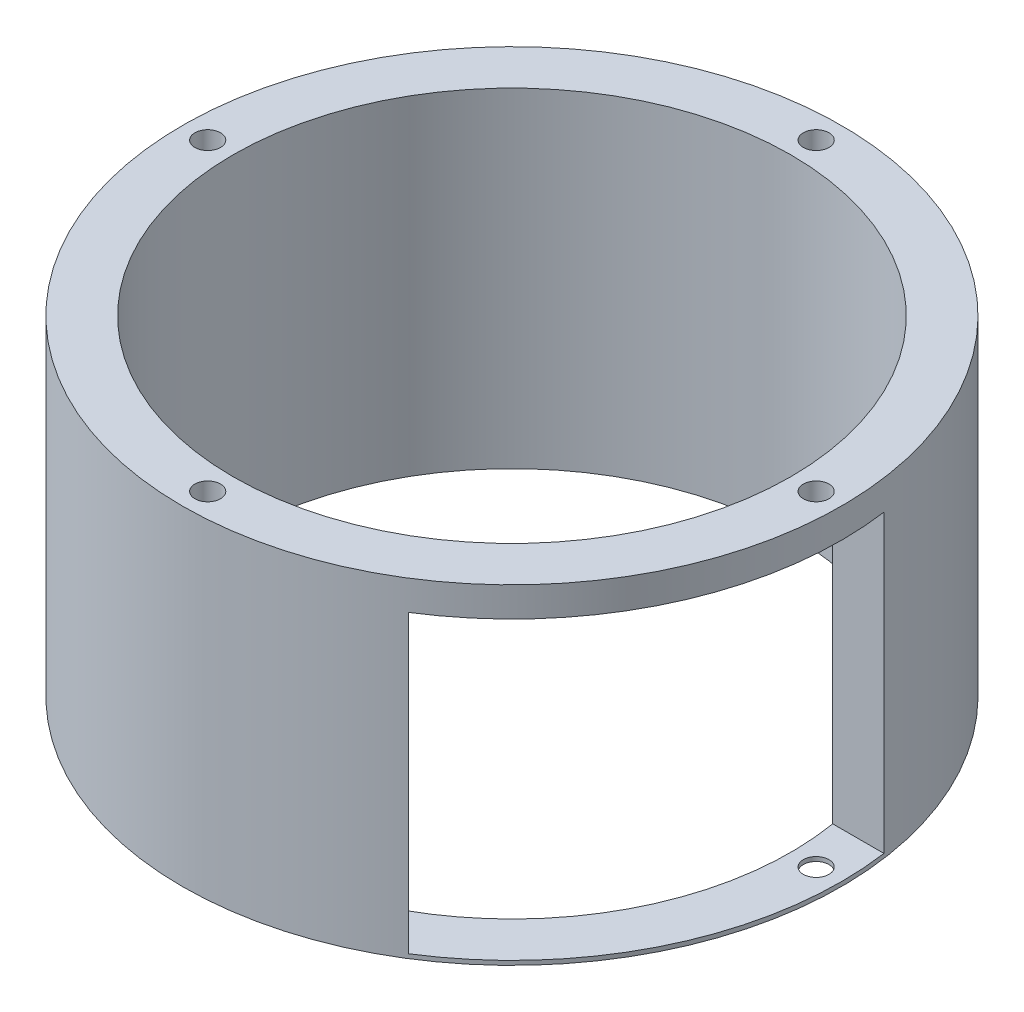
ISO-10303-21;
HEADER;
FILE_DESCRIPTION(('STEP AP214'),'2;1');
FILE_NAME('part.step','',(''),(''),'','','');
FILE_SCHEMA(('AUTOMOTIVE_DESIGN { 1 0 10303 214 1 1 1 1 }'));
ENDSEC;
DATA;
#1=APPLICATION_CONTEXT('core data for automotive mechanical design processes');
#2=APPLICATION_PROTOCOL_DEFINITION('international standard','automotive_design',2000,#1);
#3=PRODUCT_CONTEXT('',#1,'mechanical');
#4=PRODUCT('Part','Part','',(#3));
#5=PRODUCT_RELATED_PRODUCT_CATEGORY('part','',(#4));
#6=PRODUCT_DEFINITION_FORMATION('','',#4);
#7=PRODUCT_DEFINITION_CONTEXT('part definition',#1,'design');
#8=PRODUCT_DEFINITION('design','',#6,#7);
#9=PRODUCT_DEFINITION_SHAPE('','',#8);
#10=(LENGTH_UNIT() NAMED_UNIT(*) SI_UNIT(.MILLI.,.METRE.));
#11=(NAMED_UNIT(*) PLANE_ANGLE_UNIT() SI_UNIT($,.RADIAN.));
#12=(NAMED_UNIT(*) SI_UNIT($,.STERADIAN.) SOLID_ANGLE_UNIT());
#13=UNCERTAINTY_MEASURE_WITH_UNIT(LENGTH_MEASURE(1.E-05),#10,'distance_accuracy_value','');
#14=(GEOMETRIC_REPRESENTATION_CONTEXT(3) GLOBAL_UNCERTAINTY_ASSIGNED_CONTEXT((#13)) GLOBAL_UNIT_ASSIGNED_CONTEXT((#10,
#11,#12)) REPRESENTATION_CONTEXT('',''));
#15=CARTESIAN_POINT('',(0.,0.,0.));
#16=DIRECTION('',(0.,0.,1.));
#17=DIRECTION('',(1.,0.,0.));
#18=AXIS2_PLACEMENT_3D('',#15,#16,#17);
#19=CARTESIAN_POINT('',(0.,65.,0.));
#20=DIRECTION('',(0.,-1.,0.));
#21=DIRECTION('',(0.,0.,-1.));
#22=AXIS2_PLACEMENT_3D('',#19,#20,#21);
#23=CYLINDRICAL_SURFACE('',#22,55.);
#24=CARTESIAN_POINT('',(0.,65.,0.));
#25=DIRECTION('',(0.,1.,0.));
#26=DIRECTION('',(0.,0.,1.));
#27=AXIS2_PLACEMENT_3D('',#24,#25,#26);
#28=CIRCLE('',#27,55.);
#29=CARTESIAN_POINT('',(0.,65.,55.));
#30=VERTEX_POINT('',#29);
#31=EDGE_CURVE('E190',#30,#30,#28,.T.);
#32=ORIENTED_EDGE('',*,*,#31,.T.);
#33=EDGE_LOOP('',(#32));
#34=FACE_BOUND('',#33,.T.);
#35=CARTESIAN_POINT('',(0.,0.,0.));
#36=DIRECTION('',(0.,1.,0.));
#37=DIRECTION('',(0.,0.,1.));
#38=AXIS2_PLACEMENT_3D('',#35,#36,#37);
#39=CIRCLE('',#38,55.);
#40=CARTESIAN_POINT('',(0.,0.,55.));
#41=VERTEX_POINT('',#40);
#42=EDGE_CURVE('E172',#41,#41,#39,.T.);
#43=ORIENTED_EDGE('',*,*,#42,.F.);
#44=EDGE_LOOP('',(#43));
#45=FACE_BOUND('',#44,.T.);
#46=CARTESIAN_POINT('',(0.,59.1500000000018,0.));
#47=DIRECTION('',(0.,-1.,0.));
#48=DIRECTION('',(0.,0.,-1.));
#49=AXIS2_PLACEMENT_3D('',#46,#47,#48);
#50=CIRCLE('',#49,55.);
#51=CARTESIAN_POINT('',(54.2586398650022,59.1500000000018,-8.99999999999984));
#52=VERTEX_POINT('',#51);
#53=CARTESIAN_POINT('',(0.,59.1500000000018,55.0000000000002));
#54=VERTEX_POINT('',#53);
#55=EDGE_CURVE('E193',#52,#54,#50,.T.);
#56=ORIENTED_EDGE('',*,*,#55,.T.);
#57=DIRECTION('',(0.,-1.,0.));
#58=VECTOR('',#57,1.);
#59=CARTESIAN_POINT('',(0.,59.1500000000018,55.0000000000002));
#60=LINE('',#59,#58);
#61=CARTESIAN_POINT('',(0.,0.850000000001856,55.0000000000001));
#62=VERTEX_POINT('',#61);
#63=EDGE_CURVE('E99',#54,#62,#60,.T.);
#64=ORIENTED_EDGE('',*,*,#63,.T.);
#65=CARTESIAN_POINT('',(0.,0.850000000001835,0.));
#66=DIRECTION('',(0.,1.,0.));
#67=DIRECTION('',(0.,0.,1.));
#68=AXIS2_PLACEMENT_3D('',#65,#66,#67);
#69=CIRCLE('',#68,55.);
#70=CARTESIAN_POINT('',(54.2586398650022,0.850000000001842,-8.99999999999986));
#71=VERTEX_POINT('',#70);
#72=EDGE_CURVE('E200',#62,#71,#69,.T.);
#73=ORIENTED_EDGE('',*,*,#72,.T.);
#74=DIRECTION('',(0.,-1.,0.));
#75=VECTOR('',#74,1.);
#76=CARTESIAN_POINT('',(54.2586398650022,65.,-8.99999999999984));
#77=LINE('',#76,#75);
#78=EDGE_CURVE('E178',#71,#52,#77,.F.);
#79=ORIENTED_EDGE('',*,*,#78,.T.);
#80=EDGE_LOOP('',(#56,#64,#73,#79));
#81=FACE_BOUND('',#80,.T.);
#82=ADVANCED_FACE('F96',(#34,#45,#81),#23,.F.);
#83=CARTESIAN_POINT('',(0.,65.,0.));
#84=DIRECTION('',(0.,-1.,0.));
#85=DIRECTION('',(0.,0.,-1.));
#86=AXIS2_PLACEMENT_3D('',#83,#84,#85);
#87=CYLINDRICAL_SURFACE('',#86,65.);
#88=CARTESIAN_POINT('',(0.,65.,0.));
#89=DIRECTION('',(0.,1.,0.));
#90=DIRECTION('',(0.,0.,1.));
#91=AXIS2_PLACEMENT_3D('',#88,#89,#90);
#92=CIRCLE('',#91,65.);
#93=CARTESIAN_POINT('',(0.,65.,65.));
#94=VERTEX_POINT('',#93);
#95=EDGE_CURVE('E181',#94,#94,#92,.T.);
#96=ORIENTED_EDGE('',*,*,#95,.F.);
#97=EDGE_LOOP('',(#96));
#98=FACE_BOUND('',#97,.T.);
#99=CARTESIAN_POINT('',(0.,0.,0.));
#100=DIRECTION('',(0.,1.,0.));
#101=DIRECTION('',(0.,0.,1.));
#102=AXIS2_PLACEMENT_3D('',#99,#100,#101);
#103=CIRCLE('',#102,65.);
#104=CARTESIAN_POINT('',(0.,0.,65.));
#105=VERTEX_POINT('',#104);
#106=EDGE_CURVE('E159',#105,#105,#103,.T.);
#107=ORIENTED_EDGE('',*,*,#106,.T.);
#108=EDGE_LOOP('',(#107));
#109=FACE_BOUND('',#108,.T.);
#110=CARTESIAN_POINT('',(0.,0.850000000001835,0.));
#111=DIRECTION('',(0.,1.,0.));
#112=DIRECTION('',(0.,0.,1.));
#113=AXIS2_PLACEMENT_3D('',#110,#111,#112);
#114=CIRCLE('',#113,65.);
#115=CARTESIAN_POINT('',(34.6410161513773,0.850000000001847,55.0000000000001));
#116=VERTEX_POINT('',#115);
#117=CARTESIAN_POINT('',(64.3739077577244,0.850000000001842,-8.99999999999986));
#118=VERTEX_POINT('',#117);
#119=EDGE_CURVE('E146',#116,#118,#114,.T.);
#120=ORIENTED_EDGE('',*,*,#119,.F.);
#121=DIRECTION('',(0.,-1.,0.));
#122=VECTOR('',#121,1.);
#123=CARTESIAN_POINT('',(34.6410161513773,65.,55.0000000000002));
#124=LINE('',#123,#122);
#125=CARTESIAN_POINT('',(34.6410161513773,59.1500000000018,55.0000000000002));
#126=VERTEX_POINT('',#125);
#127=EDGE_CURVE('E105',#126,#116,#124,.T.);
#128=ORIENTED_EDGE('',*,*,#127,.F.);
#129=CARTESIAN_POINT('',(0.,59.1500000000018,0.));
#130=DIRECTION('',(0.,-1.,0.));
#131=DIRECTION('',(0.,0.,-1.));
#132=AXIS2_PLACEMENT_3D('',#129,#130,#131);
#133=CIRCLE('',#132,65.);
#134=CARTESIAN_POINT('',(64.3739077577244,59.1500000000018,-8.99999999999984));
#135=VERTEX_POINT('',#134);
#136=EDGE_CURVE('E133',#135,#126,#133,.T.);
#137=ORIENTED_EDGE('',*,*,#136,.F.);
#138=DIRECTION('',(0.,-1.,0.));
#139=VECTOR('',#138,1.);
#140=CARTESIAN_POINT('',(64.3739077577244,65.,-8.99999999999984));
#141=LINE('',#140,#139);
#142=EDGE_CURVE('E150',#118,#135,#141,.F.);
#143=ORIENTED_EDGE('',*,*,#142,.F.);
#144=EDGE_LOOP('',(#120,#128,#137,#143));
#145=FACE_BOUND('',#144,.T.);
#146=ADVANCED_FACE('F148',(#98,#109,#145),#87,.T.);
#147=CARTESIAN_POINT('',(60.0000000000016,65.,-1.61324064779776E-12));
#148=DIRECTION('',(0.,-1.,0.));
#149=DIRECTION('',(0.,0.,-1.));
#150=AXIS2_PLACEMENT_3D('',#147,#148,#149);
#151=CYLINDRICAL_SURFACE('',#150,2.525);
#152=CARTESIAN_POINT('',(60.0000000000016,0.,-1.61324064779776E-12));
#153=DIRECTION('',(0.,1.,0.));
#154=DIRECTION('',(0.,0.,1.));
#155=AXIS2_PLACEMENT_3D('',#152,#153,#154);
#156=CIRCLE('',#155,2.525);
#157=CARTESIAN_POINT('',(60.0000000000016,0.,2.52499999999839));
#158=VERTEX_POINT('',#157);
#159=EDGE_CURVE('E169',#158,#158,#156,.T.);
#160=ORIENTED_EDGE('',*,*,#159,.F.);
#161=EDGE_LOOP('',(#160));
#162=FACE_BOUND('',#161,.T.);
#163=CARTESIAN_POINT('',(60.0000000000016,0.850000000001835,-1.61324064779776E-12));
#164=DIRECTION('',(0.,1.,0.));
#165=DIRECTION('',(0.,0.,1.));
#166=AXIS2_PLACEMENT_3D('',#163,#164,#165);
#167=CIRCLE('',#166,2.525);
#168=CARTESIAN_POINT('',(60.0000000000016,0.850000000001836,2.52499999999839));
#169=VERTEX_POINT('',#168);
#170=EDGE_CURVE('E155',#169,#169,#167,.T.);
#171=ORIENTED_EDGE('',*,*,#170,.T.);
#172=EDGE_LOOP('',(#171));
#173=FACE_BOUND('',#172,.T.);
#174=ADVANCED_FACE('F228',(#162,#173),#151,.F.);
#175=CARTESIAN_POINT('',(60.0000000000016,65.,-1.61324064779776E-12));
#176=DIRECTION('',(0.,1.,0.));
#177=DIRECTION('',(0.,0.,1.));
#178=AXIS2_PLACEMENT_3D('',#175,#176,#177);
#179=CIRCLE('',#178,2.525);
#180=CARTESIAN_POINT('',(60.0000000000016,65.,2.52499999999839));
#181=VERTEX_POINT('',#180);
#182=EDGE_CURVE('E158',#181,#181,#179,.T.);
#183=ORIENTED_EDGE('',*,*,#182,.T.);
#184=EDGE_LOOP('',(#183));
#185=FACE_BOUND('',#184,.T.);
#186=CARTESIAN_POINT('',(60.0000000000016,59.1500000000018,-1.61324064779776E-12));
#187=DIRECTION('',(0.,-1.,0.));
#188=DIRECTION('',(0.,0.,-1.));
#189=AXIS2_PLACEMENT_3D('',#186,#187,#188);
#190=CIRCLE('',#189,2.525);
#191=CARTESIAN_POINT('',(60.0000000000016,59.1500000000018,-2.52500000000161));
#192=VERTEX_POINT('',#191);
#193=EDGE_CURVE('E160',#192,#192,#190,.T.);
#194=ORIENTED_EDGE('',*,*,#193,.T.);
#195=EDGE_LOOP('',(#194));
#196=FACE_BOUND('',#195,.T.);
#197=ADVANCED_FACE('F262',(#185,#196),#151,.F.);
#198=CARTESIAN_POINT('',(3.22648129559552E-12,65.,60.));
#199=DIRECTION('',(0.,-1.,0.));
#200=DIRECTION('',(0.,0.,-1.));
#201=AXIS2_PLACEMENT_3D('',#198,#199,#200);
#202=CYLINDRICAL_SURFACE('',#201,2.525);
#203=CARTESIAN_POINT('',(3.22648129559552E-12,65.,60.));
#204=DIRECTION('',(0.,1.,0.));
#205=DIRECTION('',(0.,0.,1.));
#206=AXIS2_PLACEMENT_3D('',#203,#204,#205);
#207=CIRCLE('',#206,2.525);
#208=CARTESIAN_POINT('',(3.22648129559552E-12,65.,62.525));
#209=VERTEX_POINT('',#208);
#210=EDGE_CURVE('E163',#209,#209,#207,.T.);
#211=ORIENTED_EDGE('',*,*,#210,.T.);
#212=EDGE_LOOP('',(#211));
#213=FACE_BOUND('',#212,.T.);
#214=CARTESIAN_POINT('',(3.22648129559552E-12,0.,60.));
#215=DIRECTION('',(0.,1.,0.));
#216=DIRECTION('',(0.,0.,1.));
#217=AXIS2_PLACEMENT_3D('',#214,#215,#216);
#218=CIRCLE('',#217,2.525);
#219=CARTESIAN_POINT('',(3.22648129559552E-12,0.,62.525));
#220=VERTEX_POINT('',#219);
#221=EDGE_CURVE('E166',#220,#220,#218,.T.);
#222=ORIENTED_EDGE('',*,*,#221,.F.);
#223=EDGE_LOOP('',(#222));
#224=FACE_BOUND('',#223,.T.);
#225=ADVANCED_FACE('F257',(#213,#224),#202,.F.);
#226=CARTESIAN_POINT('',(0.,65.,-60.));
#227=DIRECTION('',(0.,-1.,0.));
#228=DIRECTION('',(0.,0.,-1.));
#229=AXIS2_PLACEMENT_3D('',#226,#227,#228);
#230=CYLINDRICAL_SURFACE('',#229,2.525);
#231=CARTESIAN_POINT('',(0.,65.,-60.));
#232=DIRECTION('',(0.,1.,0.));
#233=DIRECTION('',(0.,0.,1.));
#234=AXIS2_PLACEMENT_3D('',#231,#232,#233);
#235=CIRCLE('',#234,2.525);
#236=CARTESIAN_POINT('',(0.,65.,-57.475));
#237=VERTEX_POINT('',#236);
#238=EDGE_CURVE('E185',#237,#237,#235,.T.);
#239=ORIENTED_EDGE('',*,*,#238,.T.);
#240=EDGE_LOOP('',(#239));
#241=FACE_BOUND('',#240,.T.);
#242=CARTESIAN_POINT('',(0.,0.,-60.));
#243=DIRECTION('',(0.,1.,0.));
#244=DIRECTION('',(0.,0.,1.));
#245=AXIS2_PLACEMENT_3D('',#242,#243,#244);
#246=CIRCLE('',#245,2.525);
#247=CARTESIAN_POINT('',(0.,0.,-57.475));
#248=VERTEX_POINT('',#247);
#249=EDGE_CURVE('E175',#248,#248,#246,.T.);
#250=ORIENTED_EDGE('',*,*,#249,.F.);
#251=EDGE_LOOP('',(#250));
#252=FACE_BOUND('',#251,.T.);
#253=ADVANCED_FACE('F248',(#241,#252),#230,.F.);
#254=CARTESIAN_POINT('',(-59.9999999999984,65.,1.62058852859264E-12));
#255=DIRECTION('',(0.,-1.,0.));
#256=DIRECTION('',(0.,0.,-1.));
#257=AXIS2_PLACEMENT_3D('',#254,#255,#256);
#258=CYLINDRICAL_SURFACE('',#257,2.525);
#259=CARTESIAN_POINT('',(-59.9999999999984,65.,1.62058852859264E-12));
#260=DIRECTION('',(0.,1.,0.));
#261=DIRECTION('',(0.,0.,1.));
#262=AXIS2_PLACEMENT_3D('',#259,#260,#261);
#263=CIRCLE('',#262,2.525);
#264=CARTESIAN_POINT('',(-59.9999999999984,65.,2.52500000000162));
#265=VERTEX_POINT('',#264);
#266=EDGE_CURVE('E182',#265,#265,#263,.T.);
#267=ORIENTED_EDGE('',*,*,#266,.T.);
#268=EDGE_LOOP('',(#267));
#269=FACE_BOUND('',#268,.T.);
#270=CARTESIAN_POINT('',(-59.9999999999984,0.,1.62058852859264E-12));
#271=DIRECTION('',(0.,1.,0.));
#272=DIRECTION('',(0.,0.,1.));
#273=AXIS2_PLACEMENT_3D('',#270,#271,#272);
#274=CIRCLE('',#273,2.525);
#275=CARTESIAN_POINT('',(-59.9999999999984,0.,2.52500000000162));
#276=VERTEX_POINT('',#275);
#277=EDGE_CURVE('E142',#276,#276,#274,.T.);
#278=ORIENTED_EDGE('',*,*,#277,.F.);
#279=EDGE_LOOP('',(#278));
#280=FACE_BOUND('',#279,.T.);
#281=ADVANCED_FACE('F246',(#269,#280),#258,.F.);
#282=CARTESIAN_POINT('',(0.,65.,0.));
#283=DIRECTION('',(0.,1.,0.));
#284=DIRECTION('',(0.,0.,1.));
#285=AXIS2_PLACEMENT_3D('',#282,#283,#284);
#286=PLANE('',#285);
#287=ORIENTED_EDGE('',*,*,#238,.F.);
#288=EDGE_LOOP('',(#287));
#289=FACE_BOUND('',#288,.T.);
#290=ORIENTED_EDGE('',*,*,#95,.T.);
#291=EDGE_LOOP('',(#290));
#292=FACE_BOUND('',#291,.T.);
#293=ORIENTED_EDGE('',*,*,#31,.F.);
#294=EDGE_LOOP('',(#293));
#295=FACE_BOUND('',#294,.T.);
#296=ORIENTED_EDGE('',*,*,#182,.F.);
#297=EDGE_LOOP('',(#296));
#298=FACE_BOUND('',#297,.T.);
#299=ORIENTED_EDGE('',*,*,#210,.F.);
#300=EDGE_LOOP('',(#299));
#301=FACE_BOUND('',#300,.T.);
#302=ORIENTED_EDGE('',*,*,#266,.F.);
#303=EDGE_LOOP('',(#302));
#304=FACE_BOUND('',#303,.T.);
#305=ADVANCED_FACE('F237',(#289,#292,#295,#298,#301,#304),#286,.T.);
#306=CARTESIAN_POINT('',(0.,0.,0.));
#307=DIRECTION('',(0.,1.,0.));
#308=DIRECTION('',(0.,0.,1.));
#309=AXIS2_PLACEMENT_3D('',#306,#307,#308);
#310=PLANE('',#309);
#311=ORIENTED_EDGE('',*,*,#249,.T.);
#312=EDGE_LOOP('',(#311));
#313=FACE_BOUND('',#312,.T.);
#314=ORIENTED_EDGE('',*,*,#106,.F.);
#315=EDGE_LOOP('',(#314));
#316=FACE_BOUND('',#315,.T.);
#317=ORIENTED_EDGE('',*,*,#42,.T.);
#318=EDGE_LOOP('',(#317));
#319=FACE_BOUND('',#318,.T.);
#320=ORIENTED_EDGE('',*,*,#159,.T.);
#321=EDGE_LOOP('',(#320));
#322=FACE_BOUND('',#321,.T.);
#323=ORIENTED_EDGE('',*,*,#221,.T.);
#324=EDGE_LOOP('',(#323));
#325=FACE_BOUND('',#324,.T.);
#326=ORIENTED_EDGE('',*,*,#277,.T.);
#327=EDGE_LOOP('',(#326));
#328=FACE_BOUND('',#327,.T.);
#329=ADVANCED_FACE('F234',(#313,#316,#319,#322,#325,#328),#310,.F.);
#330=CARTESIAN_POINT('',(65.,59.1500000000018,-8.99999999999984));
#331=DIRECTION('',(0.,-1.,0.));
#332=DIRECTION('',(0.,0.,-1.));
#333=AXIS2_PLACEMENT_3D('',#330,#331,#332);
#334=PLANE('',#333);
#335=ORIENTED_EDGE('',*,*,#193,.F.);
#336=EDGE_LOOP('',(#335));
#337=FACE_BOUND('',#336,.T.);
#338=DIRECTION('',(-1.,0.,0.));
#339=VECTOR('',#338,1.);
#340=CARTESIAN_POINT('',(65.,59.1500000000018,-8.99999999999984));
#341=LINE('',#340,#339);
#342=EDGE_CURVE('E138',#135,#52,#341,.T.);
#343=ORIENTED_EDGE('',*,*,#342,.F.);
#344=ORIENTED_EDGE('',*,*,#136,.T.);
#345=DIRECTION('',(-1.,0.,0.));
#346=VECTOR('',#345,1.);
#347=CARTESIAN_POINT('',(65.,59.1500000000018,55.0000000000002));
#348=LINE('',#347,#346);
#349=EDGE_CURVE('E135',#126,#54,#348,.T.);
#350=ORIENTED_EDGE('',*,*,#349,.T.);
#351=ORIENTED_EDGE('',*,*,#55,.F.);
#352=EDGE_LOOP('',(#343,#344,#350,#351));
#353=FACE_BOUND('',#352,.T.);
#354=ADVANCED_FACE('F134',(#337,#353),#334,.T.);
#355=CARTESIAN_POINT('',(65.,0.850000000001856,55.0000000000001));
#356=DIRECTION('',(0.,1.,0.));
#357=DIRECTION('',(0.,0.,1.));
#358=AXIS2_PLACEMENT_3D('',#355,#356,#357);
#359=PLANE('',#358);
#360=ORIENTED_EDGE('',*,*,#170,.F.);
#361=EDGE_LOOP('',(#360));
#362=FACE_BOUND('',#361,.T.);
#363=DIRECTION('',(-1.,0.,0.));
#364=VECTOR('',#363,1.);
#365=CARTESIAN_POINT('',(65.,0.850000000001856,55.0000000000001));
#366=LINE('',#365,#364);
#367=EDGE_CURVE('E14',#116,#62,#366,.T.);
#368=ORIENTED_EDGE('',*,*,#367,.F.);
#369=ORIENTED_EDGE('',*,*,#119,.T.);
#370=DIRECTION('',(-1.,0.,0.));
#371=VECTOR('',#370,1.);
#372=CARTESIAN_POINT('',(65.,0.850000000001842,-8.99999999999986));
#373=LINE('',#372,#371);
#374=EDGE_CURVE('E154',#118,#71,#373,.T.);
#375=ORIENTED_EDGE('',*,*,#374,.T.);
#376=ORIENTED_EDGE('',*,*,#72,.F.);
#377=EDGE_LOOP('',(#368,#369,#375,#376));
#378=FACE_BOUND('',#377,.T.);
#379=ADVANCED_FACE('F209',(#362,#378),#359,.T.);
#380=CARTESIAN_POINT('',(65.,0.850000000001842,-8.99999999999986));
#381=DIRECTION('',(0.,0.,1.));
#382=DIRECTION('',(0.,-1.,0.));
#383=AXIS2_PLACEMENT_3D('',#380,#381,#382);
#384=PLANE('',#383);
#385=ORIENTED_EDGE('',*,*,#374,.F.);
#386=ORIENTED_EDGE('',*,*,#142,.T.);
#387=ORIENTED_EDGE('',*,*,#342,.T.);
#388=ORIENTED_EDGE('',*,*,#78,.F.);
#389=EDGE_LOOP('',(#385,#386,#387,#388));
#390=FACE_BOUND('',#389,.T.);
#391=ADVANCED_FACE('F212',(#390),#384,.T.);
#392=CARTESIAN_POINT('',(65.,59.1500000000018,55.0000000000002));
#393=DIRECTION('',(0.,0.,-1.));
#394=DIRECTION('',(0.,1.,0.));
#395=AXIS2_PLACEMENT_3D('',#392,#393,#394);
#396=PLANE('',#395);
#397=ORIENTED_EDGE('',*,*,#127,.T.);
#398=ORIENTED_EDGE('',*,*,#367,.T.);
#399=ORIENTED_EDGE('',*,*,#63,.F.);
#400=ORIENTED_EDGE('',*,*,#349,.F.);
#401=EDGE_LOOP('',(#397,#398,#399,#400));
#402=FACE_BOUND('',#401,.T.);
#403=ADVANCED_FACE('F144',(#402),#396,.T.);
#404=CLOSED_SHELL('',(#82,#146,#174,#197,#225,#253,#281,#305,#329,#354,#379,#391,#403));
#405=MANIFOLD_SOLID_BREP('B2',#404);
#406=ADVANCED_BREP_SHAPE_REPRESENTATION('',(#18,#405),#14);
#407=SHAPE_DEFINITION_REPRESENTATION(#9,#406);
ENDSEC;
END-ISO-10303-21;
